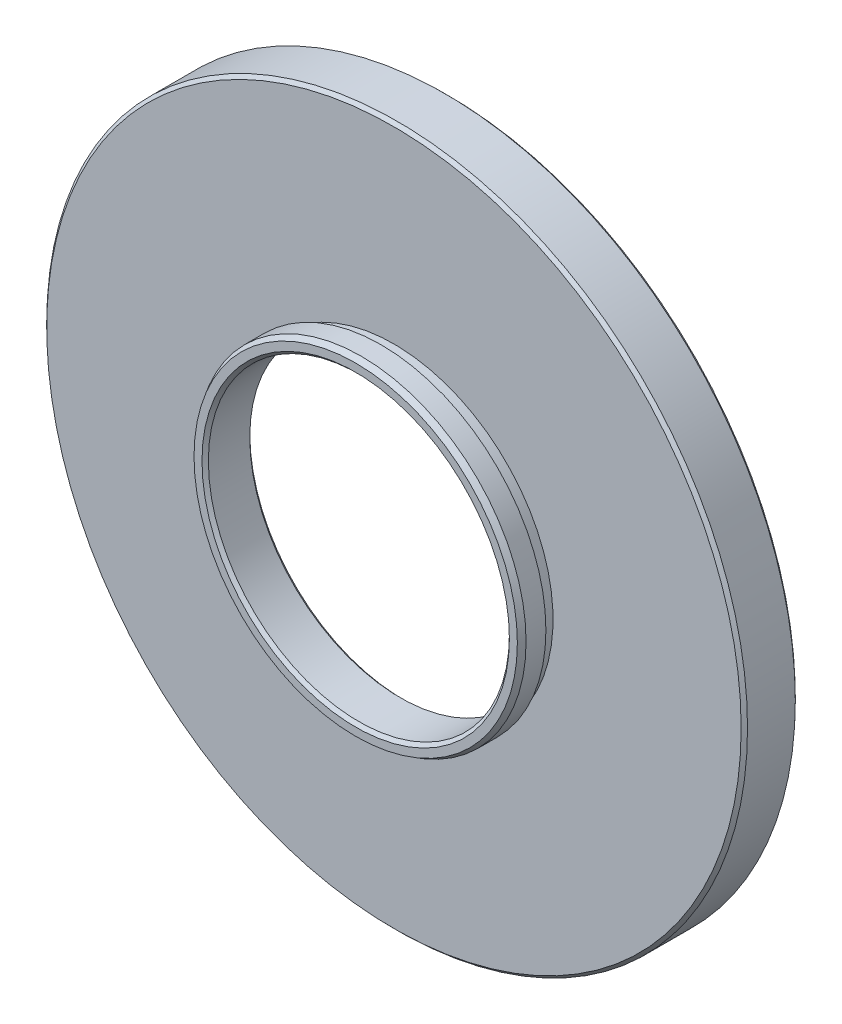
ISO-10303-21;
HEADER;
FILE_DESCRIPTION(('STEP AP214'),'2;1');
FILE_NAME('part.step','',(''),(''),'','','');
FILE_SCHEMA(('AUTOMOTIVE_DESIGN { 1 0 10303 214 1 1 1 1 }'));
ENDSEC;
DATA;
#1=APPLICATION_CONTEXT('core data for automotive mechanical design processes');
#2=APPLICATION_PROTOCOL_DEFINITION('international standard','automotive_design',2000,#1);
#3=PRODUCT_CONTEXT('',#1,'mechanical');
#4=PRODUCT('Part','Part','',(#3));
#5=PRODUCT_RELATED_PRODUCT_CATEGORY('part','',(#4));
#6=PRODUCT_DEFINITION_FORMATION('','',#4);
#7=PRODUCT_DEFINITION_CONTEXT('part definition',#1,'design');
#8=PRODUCT_DEFINITION('design','',#6,#7);
#9=PRODUCT_DEFINITION_SHAPE('','',#8);
#10=(LENGTH_UNIT() NAMED_UNIT(*) SI_UNIT(.MILLI.,.METRE.));
#11=(NAMED_UNIT(*) PLANE_ANGLE_UNIT() SI_UNIT($,.RADIAN.));
#12=(NAMED_UNIT(*) SI_UNIT($,.STERADIAN.) SOLID_ANGLE_UNIT());
#13=UNCERTAINTY_MEASURE_WITH_UNIT(LENGTH_MEASURE(1.E-05),#10,'distance_accuracy_value','');
#14=(GEOMETRIC_REPRESENTATION_CONTEXT(3) GLOBAL_UNCERTAINTY_ASSIGNED_CONTEXT((#13)) GLOBAL_UNIT_ASSIGNED_CONTEXT((#10,
#11,#12)) REPRESENTATION_CONTEXT('',''));
#15=CARTESIAN_POINT('',(0.,0.,0.));
#16=DIRECTION('',(0.,0.,1.));
#17=DIRECTION('',(1.,0.,0.));
#18=AXIS2_PLACEMENT_3D('',#15,#16,#17);
#19=CARTESIAN_POINT('',(0.,27.94,-4.318));
#20=DIRECTION('',(0.,0.,-1.));
#21=DIRECTION('',(-1.,0.,0.));
#22=AXIS2_PLACEMENT_3D('',#19,#20,#21);
#23=PLANE('',#22);
#24=CARTESIAN_POINT('',(0.,0.,-4.318));
#25=DIRECTION('',(0.,0.,-1.));
#26=DIRECTION('',(-1.,0.,0.));
#27=AXIS2_PLACEMENT_3D('',#24,#25,#26);
#28=CIRCLE('',#27,27.686);
#29=CARTESIAN_POINT('',(-27.686,0.,-4.318));
#30=VERTEX_POINT('',#29);
#31=EDGE_CURVE('E39',#30,#30,#28,.T.);
#32=ORIENTED_EDGE('',*,*,#31,.T.);
#33=EDGE_LOOP('',(#32));
#34=FACE_BOUND('',#33,.T.);
#35=CARTESIAN_POINT('',(0.,0.,-4.318));
#36=DIRECTION('',(0.,0.,-1.));
#37=DIRECTION('',(-1.,0.,0.));
#38=AXIS2_PLACEMENT_3D('',#35,#36,#37);
#39=CIRCLE('',#38,26.0985);
#40=CARTESIAN_POINT('',(-26.0985,0.,-4.318));
#41=VERTEX_POINT('',#40);
#42=EDGE_CURVE('E54',#41,#41,#39,.F.);
#43=ORIENTED_EDGE('',*,*,#42,.T.);
#44=EDGE_LOOP('',(#43));
#45=FACE_BOUND('',#44,.T.);
#46=ADVANCED_FACE('F14',(#34,#45),#23,.T.);
#47=CARTESIAN_POINT('',(0.,0.,-4.318));
#48=DIRECTION('',(0.,0.,-1.));
#49=DIRECTION('',(-1.,0.,0.));
#50=AXIS2_PLACEMENT_3D('',#47,#48,#49);
#51=CYLINDRICAL_SURFACE('',#50,27.94);
#52=CARTESIAN_POINT('',(0.,0.,-4.06400000000001));
#53=DIRECTION('',(0.,0.,-1.));
#54=DIRECTION('',(-1.,0.,0.));
#55=AXIS2_PLACEMENT_3D('',#52,#53,#54);
#56=CIRCLE('',#55,27.94);
#57=CARTESIAN_POINT('',(-27.94,0.,-4.06400000000001));
#58=VERTEX_POINT('',#57);
#59=EDGE_CURVE('E26',#58,#58,#56,.F.);
#60=ORIENTED_EDGE('',*,*,#59,.T.);
#61=EDGE_LOOP('',(#60));
#62=FACE_BOUND('',#61,.T.);
#63=CARTESIAN_POINT('',(0.,0.,-0.25399999999999));
#64=DIRECTION('',(0.,0.,1.));
#65=DIRECTION('',(1.,0.,0.));
#66=AXIS2_PLACEMENT_3D('',#63,#64,#65);
#67=CIRCLE('',#66,27.94);
#68=CARTESIAN_POINT('',(27.94,0.,-0.25399999999999));
#69=VERTEX_POINT('',#68);
#70=EDGE_CURVE('E34',#69,#69,#67,.F.);
#71=ORIENTED_EDGE('',*,*,#70,.T.);
#72=EDGE_LOOP('',(#71));
#73=FACE_BOUND('',#72,.T.);
#74=ADVANCED_FACE('F113',(#62,#73),#51,.T.);
#75=CARTESIAN_POINT('',(0.,27.94,0.));
#76=DIRECTION('',(0.,0.,1.));
#77=DIRECTION('',(1.,0.,0.));
#78=AXIS2_PLACEMENT_3D('',#75,#76,#77);
#79=PLANE('',#78);
#80=CARTESIAN_POINT('',(0.,0.,0.));
#81=DIRECTION('',(0.,0.,1.));
#82=DIRECTION('',(1.,0.,0.));
#83=AXIS2_PLACEMENT_3D('',#80,#81,#82);
#84=CIRCLE('',#83,27.686);
#85=CARTESIAN_POINT('',(27.686,0.,0.));
#86=VERTEX_POINT('',#85);
#87=EDGE_CURVE('E21',#86,#86,#84,.T.);
#88=ORIENTED_EDGE('',*,*,#87,.T.);
#89=EDGE_LOOP('',(#88));
#90=FACE_BOUND('',#89,.T.);
#91=CARTESIAN_POINT('',(0.,0.,0.));
#92=DIRECTION('',(0.,0.,-1.));
#93=DIRECTION('',(-1.,0.,0.));
#94=AXIS2_PLACEMENT_3D('',#91,#92,#93);
#95=CIRCLE('',#94,12.6873);
#96=CARTESIAN_POINT('',(-12.6873,0.,0.));
#97=VERTEX_POINT('',#96);
#98=EDGE_CURVE('E70',#97,#97,#95,.T.);
#99=ORIENTED_EDGE('',*,*,#98,.T.);
#100=EDGE_LOOP('',(#99));
#101=FACE_BOUND('',#100,.T.);
#102=ADVANCED_FACE('F118',(#90,#101),#79,.T.);
#103=CARTESIAN_POINT('',(0.,0.,-4.318));
#104=DIRECTION('',(0.,0.,-1.));
#105=DIRECTION('',(-1.,0.,0.));
#106=AXIS2_PLACEMENT_3D('',#103,#104,#105);
#107=CYLINDRICAL_SURFACE('',#106,12.6873);
#108=CARTESIAN_POINT('',(0.,0.,0.761999999999999));
#109=DIRECTION('',(0.,0.,-1.));
#110=DIRECTION('',(-1.,0.,0.));
#111=AXIS2_PLACEMENT_3D('',#108,#109,#110);
#112=CIRCLE('',#111,12.6873);
#113=CARTESIAN_POINT('',(-12.6873,0.,0.761999999999999));
#114=VERTEX_POINT('',#113);
#115=EDGE_CURVE('E74',#114,#114,#112,.T.);
#116=ORIENTED_EDGE('',*,*,#115,.T.);
#117=EDGE_LOOP('',(#116));
#118=FACE_BOUND('',#117,.T.);
#119=ORIENTED_EDGE('',*,*,#98,.F.);
#120=EDGE_LOOP('',(#119));
#121=FACE_BOUND('',#120,.T.);
#122=ADVANCED_FACE('F172',(#118,#121),#107,.T.);
#123=CARTESIAN_POINT('',(0.,0.,0.761999999999999));
#124=DIRECTION('',(0.,0.,1.));
#125=DIRECTION('',(1.,0.,0.));
#126=AXIS2_PLACEMENT_3D('',#123,#124,#125);
#127=CONICAL_SURFACE('',#126,12.6873,1.0471975511966);
#128=CARTESIAN_POINT('',(0.,0.,1.02596454307349));
#129=DIRECTION('',(0.,0.,-1.));
#130=DIRECTION('',(-1.,0.,0.));
#131=AXIS2_PLACEMENT_3D('',#128,#129,#130);
#132=CIRCLE('',#131,13.1445);
#133=CARTESIAN_POINT('',(-13.1445,0.,1.02596454307349));
#134=VERTEX_POINT('',#133);
#135=EDGE_CURVE('E78',#134,#134,#132,.T.);
#136=ORIENTED_EDGE('',*,*,#135,.T.);
#137=EDGE_LOOP('',(#136));
#138=FACE_BOUND('',#137,.T.);
#139=ORIENTED_EDGE('',*,*,#115,.F.);
#140=EDGE_LOOP('',(#139));
#141=FACE_BOUND('',#140,.T.);
#142=ADVANCED_FACE('F168',(#138,#141),#127,.T.);
#143=CARTESIAN_POINT('',(0.,0.,-4.318));
#144=DIRECTION('',(0.,0.,-1.));
#145=DIRECTION('',(-1.,0.,0.));
#146=AXIS2_PLACEMENT_3D('',#143,#144,#145);
#147=CYLINDRICAL_SURFACE('',#146,13.1445);
#148=CARTESIAN_POINT('',(0.,0.,2.60805909487752));
#149=DIRECTION('',(0.,0.,1.));
#150=DIRECTION('',(1.,0.,0.));
#151=AXIS2_PLACEMENT_3D('',#148,#149,#150);
#152=CIRCLE('',#151,13.1445);
#153=CARTESIAN_POINT('',(-13.1445,0.,2.60805909487752));
#154=VERTEX_POINT('',#153);
#155=EDGE_CURVE('E66',#154,#154,#152,.F.);
#156=ORIENTED_EDGE('',*,*,#155,.T.);
#157=EDGE_LOOP('',(#156));
#158=FACE_BOUND('',#157,.T.);
#159=ORIENTED_EDGE('',*,*,#135,.F.);
#160=EDGE_LOOP('',(#159));
#161=FACE_BOUND('',#160,.T.);
#162=ADVANCED_FACE('F162',(#158,#161),#147,.T.);
#163=CARTESIAN_POINT('',(0.,13.1445,3.048));
#164=DIRECTION('',(0.,0.,1.));
#165=DIRECTION('',(1.,0.,0.));
#166=AXIS2_PLACEMENT_3D('',#163,#164,#165);
#167=PLANE('',#166);
#168=CARTESIAN_POINT('',(0.,0.,3.048));
#169=DIRECTION('',(0.,0.,1.));
#170=DIRECTION('',(1.,0.,0.));
#171=AXIS2_PLACEMENT_3D('',#168,#169,#170);
#172=CIRCLE('',#171,12.2555);
#173=CARTESIAN_POINT('',(12.2555,0.,3.048));
#174=VERTEX_POINT('',#173);
#175=EDGE_CURVE('E10',#174,#174,#172,.F.);
#176=ORIENTED_EDGE('',*,*,#175,.T.);
#177=EDGE_LOOP('',(#176));
#178=FACE_BOUND('',#177,.T.);
#179=CARTESIAN_POINT('',(0.,0.,3.048));
#180=DIRECTION('',(0.,0.,1.));
#181=DIRECTION('',(1.,0.,0.));
#182=AXIS2_PLACEMENT_3D('',#179,#180,#181);
#183=CIRCLE('',#182,12.8905);
#184=CARTESIAN_POINT('',(-12.8905,0.,3.048));
#185=VERTEX_POINT('',#184);
#186=EDGE_CURVE('E62',#185,#185,#183,.T.);
#187=ORIENTED_EDGE('',*,*,#186,.T.);
#188=EDGE_LOOP('',(#187));
#189=FACE_BOUND('',#188,.T.);
#190=ADVANCED_FACE('F152',(#178,#189),#167,.T.);
#191=CARTESIAN_POINT('',(0.,0.,-4.318));
#192=DIRECTION('',(0.,0.,-1.));
#193=DIRECTION('',(-1.,0.,0.));
#194=AXIS2_PLACEMENT_3D('',#191,#192,#193);
#195=CYLINDRICAL_SURFACE('',#194,12.0015);
#196=CARTESIAN_POINT('',(0.,0.,-0.508000000000021));
#197=DIRECTION('',(0.,0.,-1.));
#198=DIRECTION('',(-1.,0.,0.));
#199=AXIS2_PLACEMENT_3D('',#196,#197,#198);
#200=CIRCLE('',#199,12.0015);
#201=CARTESIAN_POINT('',(-12.0015,0.,-0.508000000000021));
#202=VERTEX_POINT('',#201);
#203=EDGE_CURVE('E47',#202,#202,#200,.T.);
#204=ORIENTED_EDGE('',*,*,#203,.T.);
#205=EDGE_LOOP('',(#204));
#206=FACE_BOUND('',#205,.T.);
#207=CARTESIAN_POINT('',(0.,0.,2.79399999999999));
#208=DIRECTION('',(0.,0.,1.));
#209=DIRECTION('',(1.,0.,0.));
#210=AXIS2_PLACEMENT_3D('',#207,#208,#209);
#211=CIRCLE('',#210,12.0015);
#212=CARTESIAN_POINT('',(12.0015,0.,2.79399999999999));
#213=VERTEX_POINT('',#212);
#214=EDGE_CURVE('E51',#213,#213,#211,.T.);
#215=ORIENTED_EDGE('',*,*,#214,.T.);
#216=EDGE_LOOP('',(#215));
#217=FACE_BOUND('',#216,.T.);
#218=ADVANCED_FACE('F149',(#206,#217),#195,.F.);
#219=CARTESIAN_POINT('',(0.,12.0015,-0.762000000000003));
#220=DIRECTION('',(0.,0.,-1.));
#221=DIRECTION('',(-1.,0.,0.));
#222=AXIS2_PLACEMENT_3D('',#219,#220,#221);
#223=PLANE('',#222);
#224=CARTESIAN_POINT('',(0.,0.,-0.762000000000003));
#225=DIRECTION('',(0.,0.,-1.));
#226=DIRECTION('',(-1.,0.,0.));
#227=AXIS2_PLACEMENT_3D('',#224,#225,#226);
#228=CIRCLE('',#227,12.2555);
#229=CARTESIAN_POINT('',(-12.2555,0.,-0.762000000000003));
#230=VERTEX_POINT('',#229);
#231=EDGE_CURVE('E43',#230,#230,#228,.F.);
#232=ORIENTED_EDGE('',*,*,#231,.T.);
#233=EDGE_LOOP('',(#232));
#234=FACE_BOUND('',#233,.T.);
#235=CARTESIAN_POINT('',(0.,0.,-0.762000000000003));
#236=DIRECTION('',(0.,0.,-1.));
#237=DIRECTION('',(-1.,0.,0.));
#238=AXIS2_PLACEMENT_3D('',#235,#236,#237);
#239=CIRCLE('',#238,26.3525);
#240=CARTESIAN_POINT('',(-26.3525,0.,-0.762000000000003));
#241=VERTEX_POINT('',#240);
#242=EDGE_CURVE('E82',#241,#241,#239,.T.);
#243=ORIENTED_EDGE('',*,*,#242,.T.);
#244=EDGE_LOOP('',(#243));
#245=FACE_BOUND('',#244,.T.);
#246=ADVANCED_FACE('F151',(#234,#245),#223,.T.);
#247=CARTESIAN_POINT('',(0.,0.,-4.318));
#248=DIRECTION('',(0.,0.,-1.));
#249=DIRECTION('',(-1.,0.,0.));
#250=AXIS2_PLACEMENT_3D('',#247,#248,#249);
#251=CYLINDRICAL_SURFACE('',#250,26.3525);
#252=CARTESIAN_POINT('',(0.,0.,-1.524));
#253=DIRECTION('',(0.,0.,-1.));
#254=DIRECTION('',(-1.,0.,0.));
#255=AXIS2_PLACEMENT_3D('',#252,#253,#254);
#256=CIRCLE('',#255,26.3525);
#257=CARTESIAN_POINT('',(-26.3525,0.,-1.524));
#258=VERTEX_POINT('',#257);
#259=EDGE_CURVE('E85',#258,#258,#256,.T.);
#260=ORIENTED_EDGE('',*,*,#259,.T.);
#261=EDGE_LOOP('',(#260));
#262=FACE_BOUND('',#261,.T.);
#263=ORIENTED_EDGE('',*,*,#242,.F.);
#264=EDGE_LOOP('',(#263));
#265=FACE_BOUND('',#264,.T.);
#266=ADVANCED_FACE('F111',(#262,#265),#251,.F.);
#267=CARTESIAN_POINT('',(0.,26.3525,-1.524));
#268=DIRECTION('',(0.,0.,1.));
#269=DIRECTION('',(1.,0.,0.));
#270=AXIS2_PLACEMENT_3D('',#267,#268,#269);
#271=PLANE('',#270);
#272=CARTESIAN_POINT('',(0.,0.,-1.524));
#273=DIRECTION('',(0.,0.,-1.));
#274=DIRECTION('',(-1.,0.,0.));
#275=AXIS2_PLACEMENT_3D('',#272,#273,#274);
#276=CIRCLE('',#275,25.8445);
#277=CARTESIAN_POINT('',(-25.8445,0.,-1.524));
#278=VERTEX_POINT('',#277);
#279=EDGE_CURVE('E89',#278,#278,#276,.T.);
#280=ORIENTED_EDGE('',*,*,#279,.T.);
#281=EDGE_LOOP('',(#280));
#282=FACE_BOUND('',#281,.T.);
#283=ORIENTED_EDGE('',*,*,#259,.F.);
#284=EDGE_LOOP('',(#283));
#285=FACE_BOUND('',#284,.T.);
#286=ADVANCED_FACE('F94',(#282,#285),#271,.T.);
#287=CARTESIAN_POINT('',(0.,0.,-4.318));
#288=DIRECTION('',(0.,0.,-1.));
#289=DIRECTION('',(-1.,0.,0.));
#290=AXIS2_PLACEMENT_3D('',#287,#288,#289);
#291=CYLINDRICAL_SURFACE('',#290,25.8445);
#292=CARTESIAN_POINT('',(0.,0.,-3.87805909487755));
#293=DIRECTION('',(0.,0.,-1.));
#294=DIRECTION('',(-1.,0.,0.));
#295=AXIS2_PLACEMENT_3D('',#292,#293,#294);
#296=CIRCLE('',#295,25.8445);
#297=CARTESIAN_POINT('',(-25.8445,0.,-3.87805909487755));
#298=VERTEX_POINT('',#297);
#299=EDGE_CURVE('E58',#298,#298,#296,.T.);
#300=ORIENTED_EDGE('',*,*,#299,.T.);
#301=EDGE_LOOP('',(#300));
#302=FACE_BOUND('',#301,.T.);
#303=ORIENTED_EDGE('',*,*,#279,.F.);
#304=EDGE_LOOP('',(#303));
#305=FACE_BOUND('',#304,.T.);
#306=ADVANCED_FACE('F97',(#302,#305),#291,.F.);
#307=CARTESIAN_POINT('',(0.,0.,2.60805909487752));
#308=DIRECTION('',(0.,0.,-1.));
#309=DIRECTION('',(-1.,0.,0.));
#310=AXIS2_PLACEMENT_3D('',#307,#308,#309);
#311=CONICAL_SURFACE('',#310,13.1445,0.523598775598309);
#312=CARTESIAN_POINT('',(-12.8905,0.,3.048));
#313=CARTESIAN_POINT('',(-12.8931458333333,0.,3.04341728223831));
#314=CARTESIAN_POINT('',(-12.8957916666667,0.,3.03883456447661));
#315=CARTESIAN_POINT('',(-12.9010833333333,0.,3.02966912895323));
#316=CARTESIAN_POINT('',(-12.9037291666667,0.,3.02508641119154));
#317=CARTESIAN_POINT('',(-12.9090208333333,0.,3.01592097566815));
#318=CARTESIAN_POINT('',(-12.9116666666667,0.,3.01133825790646));
#319=CARTESIAN_POINT('',(-12.9169583333333,0.,3.00217282238307));
#320=CARTESIAN_POINT('',(-12.9196041666667,0.,2.99759010462138));
#321=CARTESIAN_POINT('',(-12.9248958333333,0.,2.988424669098));
#322=CARTESIAN_POINT('',(-12.9275416666667,0.,2.9838419513363));
#323=CARTESIAN_POINT('',(-12.9328333333333,0.,2.97467651581292));
#324=CARTESIAN_POINT('',(-12.9354791666667,0.,2.97009379805123));
#325=CARTESIAN_POINT('',(-12.9407708333333,0.,2.96092836252784));
#326=CARTESIAN_POINT('',(-12.9434166666667,0.,2.95634564476615));
#327=CARTESIAN_POINT('',(-12.9487083333333,0.,2.94718020924276));
#328=CARTESIAN_POINT('',(-12.9513541666667,0.,2.94259749148107));
#329=CARTESIAN_POINT('',(-12.9566458333333,0.,2.93343205595769));
#330=CARTESIAN_POINT('',(-12.9592916666667,0.,2.92884933819599));
#331=CARTESIAN_POINT('',(-12.9645833333333,0.,2.91968390267261));
#332=CARTESIAN_POINT('',(-12.9672291666667,0.,2.91510118491092));
#333=CARTESIAN_POINT('',(-12.9725208333333,0.,2.90593574938753));
#334=CARTESIAN_POINT('',(-12.9751666666667,0.,2.90135303162584));
#335=CARTESIAN_POINT('',(-12.9804583333333,0.,2.89218759610245));
#336=CARTESIAN_POINT('',(-12.9831041666667,0.,2.88760487834076));
#337=CARTESIAN_POINT('',(-12.9883958333333,0.,2.87843944281738));
#338=CARTESIAN_POINT('',(-12.9910416666667,0.,2.87385672505568));
#339=CARTESIAN_POINT('',(-12.9963333333333,0.,2.8646912895323));
#340=CARTESIAN_POINT('',(-12.9989791666667,0.,2.86010857177061));
#341=CARTESIAN_POINT('',(-13.0042708333333,0.,2.85094313624722));
#342=CARTESIAN_POINT('',(-13.0069166666667,0.,2.84636041848553));
#343=CARTESIAN_POINT('',(-13.0122083333333,0.,2.83719498296214));
#344=CARTESIAN_POINT('',(-13.0148541666667,0.,2.83261226520045));
#345=CARTESIAN_POINT('',(-13.0201458333333,0.,2.82344682967707));
#346=CARTESIAN_POINT('',(-13.0227916666667,0.,2.81886411191537));
#347=CARTESIAN_POINT('',(-13.0280833333333,0.,2.80969867639199));
#348=CARTESIAN_POINT('',(-13.0307291666667,0.,2.8051159586303));
#349=CARTESIAN_POINT('',(-13.0360208333333,0.,2.79595052310691));
#350=CARTESIAN_POINT('',(-13.0386666666667,0.,2.79136780534522));
#351=CARTESIAN_POINT('',(-13.0439583333333,0.,2.78220236982183));
#352=CARTESIAN_POINT('',(-13.0466041666667,0.,2.77761965206014));
#353=CARTESIAN_POINT('',(-13.0518958333333,0.,2.76845421653676));
#354=CARTESIAN_POINT('',(-13.0545416666667,0.,2.76387149877506));
#355=CARTESIAN_POINT('',(-13.0598333333333,0.,2.75470606325168));
#356=CARTESIAN_POINT('',(-13.0624791666667,0.,2.75012334548999));
#357=CARTESIAN_POINT('',(-13.0677708333333,0.,2.7409579099666));
#358=CARTESIAN_POINT('',(-13.0704166666667,0.,2.73637519220491));
#359=CARTESIAN_POINT('',(-13.0757083333333,0.,2.72720975668152));
#360=CARTESIAN_POINT('',(-13.0783541666667,0.,2.72262703891983));
#361=CARTESIAN_POINT('',(-13.0836458333333,0.,2.71346160339645));
#362=CARTESIAN_POINT('',(-13.0862916666667,0.,2.70887888563475));
#363=CARTESIAN_POINT('',(-13.0915833333333,0.,2.69971345011137));
#364=CARTESIAN_POINT('',(-13.0942291666667,0.,2.69513073234968));
#365=CARTESIAN_POINT('',(-13.0995208333333,0.,2.68596529682629));
#366=CARTESIAN_POINT('',(-13.1021666666667,0.,2.6813825790646));
#367=CARTESIAN_POINT('',(-13.1074583333333,0.,2.67221714354121));
#368=CARTESIAN_POINT('',(-13.1101041666667,0.,2.66763442577952));
#369=CARTESIAN_POINT('',(-13.1153958333333,0.,2.65846899025614));
#370=CARTESIAN_POINT('',(-13.1180416666667,0.,2.65388627249444));
#371=CARTESIAN_POINT('',(-13.1233333333333,0.,2.64472083697106));
#372=CARTESIAN_POINT('',(-13.1259791666667,0.,2.64013811920937));
#373=CARTESIAN_POINT('',(-13.1312708333333,0.,2.63097268368598));
#374=CARTESIAN_POINT('',(-13.1339166666667,0.,2.62638996592429));
#375=CARTESIAN_POINT('',(-13.1392083333333,0.,2.6172245304009));
#376=CARTESIAN_POINT('',(-13.1418541666667,0.,2.61264181263921));
#377=CARTESIAN_POINT('',(-13.1445,0.,2.60805909487752));
#378=B_SPLINE_CURVE_WITH_KNOTS('',3,(#312,#313,#314,#315,#316,#317,#318,#319,#320,#321,#322,
#323,#324,#325,#326,#327,#328,#329,#330,#331,#332,#333,#334,#335,#336,#337,#338,#339,#340,#341,
#342,#343,#344,#345,#346,#347,#348,#349,#350,#351,#352,#353,#354,#355,#356,#357,#358,#359,#360,
#361,#362,#363,#364,#365,#366,#367,#368,#369,#370,#371,#372,#373,#374,#375,#376,#377),
.UNSPECIFIED.,.F.,.F.,(4,2,2,2,2,2,2,2,2,2,2,2,2,2,2,2,2,2,2,2,2,2,2,2,2,2,2,2,2,2,2,2,4),(0.,
0.0158749999999991,0.0317499999999992,0.0476249999999983,0.0634999999999987,0.0793749999999978,
0.095249999999997,0.111124999999997,0.126999999999996,0.142874999999996,0.158749999999996,
0.174624999999995,0.190499999999995,0.206374999999994,0.222249999999994,0.238124999999994,
0.253999999999993,0.269874999999992,0.285749999999992,0.301624999999991,0.317499999999992,
0.333374999999991,0.34924999999999,0.36512499999999,0.380999999999989,0.396874999999989,
0.412749999999989,0.428624999999988,0.444499999999988,0.460374999999987,0.476249999999986,
0.492124999999986,0.507999999999985),.UNSPECIFIED.);
#379=EDGE_CURVE('BSEAM99',#185,#154,#378,.T.);
#380=ORIENTED_EDGE('',*,*,#186,.F.);
#381=ORIENTED_EDGE('',*,*,#155,.F.);
#382=ORIENTED_EDGE('',*,*,#379,.T.);
#383=ORIENTED_EDGE('',*,*,#379,.F.);
#384=EDGE_LOOP('',(#380,#382,#381,#383));
#385=FACE_BOUND('',#384,.T.);
#386=ADVANCED_FACE('F99',(#385),#311,.T.);
#387=CARTESIAN_POINT('',(0.,0.,-3.87805909487755));
#388=DIRECTION('',(0.,0.,-1.));
#389=DIRECTION('',(-1.,0.,0.));
#390=AXIS2_PLACEMENT_3D('',#387,#388,#389);
#391=CONICAL_SURFACE('',#390,25.8445,0.523598775598297);
#392=CARTESIAN_POINT('',(-26.0985,0.,-4.318));
#393=CARTESIAN_POINT('',(-26.0958541666666,0.,-4.31341728223831));
#394=CARTESIAN_POINT('',(-26.0932083333333,0.,-4.30883456447662));
#395=CARTESIAN_POINT('',(-26.0879166666666,0.,-4.29966912895323));
#396=CARTESIAN_POINT('',(-26.0852708333333,0.,-4.29508641119154));
#397=CARTESIAN_POINT('',(-26.0799791666666,0.,-4.28592097566816));
#398=CARTESIAN_POINT('',(-26.0773333333333,0.,-4.28133825790646));
#399=CARTESIAN_POINT('',(-26.0720416666666,0.,-4.27217282238308));
#400=CARTESIAN_POINT('',(-26.0693958333333,0.,-4.26759010462139));
#401=CARTESIAN_POINT('',(-26.0641041666666,0.,-4.258424669098));
#402=CARTESIAN_POINT('',(-26.0614583333333,0.,-4.25384195133631));
#403=CARTESIAN_POINT('',(-26.0561666666666,0.,-4.24467651581293));
#404=CARTESIAN_POINT('',(-26.0535208333333,0.,-4.24009379805123));
#405=CARTESIAN_POINT('',(-26.0482291666666,0.,-4.23092836252785));
#406=CARTESIAN_POINT('',(-26.0455833333333,0.,-4.22634564476616));
#407=CARTESIAN_POINT('',(-26.0402916666667,0.,-4.21718020924277));
#408=CARTESIAN_POINT('',(-26.0376458333333,0.,-4.21259749148108));
#409=CARTESIAN_POINT('',(-26.0323541666667,0.,-4.2034320559577));
#410=CARTESIAN_POINT('',(-26.0297083333333,0.,-4.198849338196));
#411=CARTESIAN_POINT('',(-26.0244166666666,0.,-4.18968390267262));
#412=CARTESIAN_POINT('',(-26.0217708333333,0.,-4.18510118491093));
#413=CARTESIAN_POINT('',(-26.0164791666667,0.,-4.17593574938754));
#414=CARTESIAN_POINT('',(-26.0138333333333,0.,-4.17135303162585));
#415=CARTESIAN_POINT('',(-26.0085416666667,0.,-4.16218759610247));
#416=CARTESIAN_POINT('',(-26.0058958333333,0.,-4.15760487834077));
#417=CARTESIAN_POINT('',(-26.0006041666667,0.,-4.14843944281739));
#418=CARTESIAN_POINT('',(-25.9979583333333,0.,-4.1438567250557));
#419=CARTESIAN_POINT('',(-25.9926666666667,0.,-4.13469128953231));
#420=CARTESIAN_POINT('',(-25.9900208333333,0.,-4.13010857177062));
#421=CARTESIAN_POINT('',(-25.9847291666667,0.,-4.12094313624724));
#422=CARTESIAN_POINT('',(-25.9820833333333,0.,-4.11636041848554));
#423=CARTESIAN_POINT('',(-25.9767916666667,0.,-4.10719498296216));
#424=CARTESIAN_POINT('',(-25.9741458333333,0.,-4.10261226520047));
#425=CARTESIAN_POINT('',(-25.9688541666667,0.,-4.09344682967708));
#426=CARTESIAN_POINT('',(-25.9662083333333,0.,-4.08886411191539));
#427=CARTESIAN_POINT('',(-25.9609166666667,0.,-4.07969867639201));
#428=CARTESIAN_POINT('',(-25.9582708333333,0.,-4.07511595863031));
#429=CARTESIAN_POINT('',(-25.9529791666667,0.,-4.06595052310693));
#430=CARTESIAN_POINT('',(-25.9503333333333,0.,-4.06136780534524));
#431=CARTESIAN_POINT('',(-25.9450416666667,0.,-4.05220236982185));
#432=CARTESIAN_POINT('',(-25.9423958333333,0.,-4.04761965206016));
#433=CARTESIAN_POINT('',(-25.9371041666667,0.,-4.03845421653677));
#434=CARTESIAN_POINT('',(-25.9344583333333,0.,-4.03387149877508));
#435=CARTESIAN_POINT('',(-25.9291666666667,0.,-4.0247060632517));
#436=CARTESIAN_POINT('',(-25.9265208333333,0.,-4.02012334549001));
#437=CARTESIAN_POINT('',(-25.9212291666667,0.,-4.01095790996662));
#438=CARTESIAN_POINT('',(-25.9185833333333,0.,-4.00637519220493));
#439=CARTESIAN_POINT('',(-25.9132916666667,0.,-3.99720975668155));
#440=CARTESIAN_POINT('',(-25.9106458333333,0.,-3.99262703891985));
#441=CARTESIAN_POINT('',(-25.9053541666667,0.,-3.98346160339647));
#442=CARTESIAN_POINT('',(-25.9027083333333,0.,-3.97887888563478));
#443=CARTESIAN_POINT('',(-25.8974166666667,0.,-3.96971345011139));
#444=CARTESIAN_POINT('',(-25.8947708333333,0.,-3.9651307323497));
#445=CARTESIAN_POINT('',(-25.8894791666667,0.,-3.95596529682632));
#446=CARTESIAN_POINT('',(-25.8868333333333,0.,-3.95138257906462));
#447=CARTESIAN_POINT('',(-25.8815416666667,0.,-3.94221714354124));
#448=CARTESIAN_POINT('',(-25.8788958333333,0.,-3.93763442577955));
#449=CARTESIAN_POINT('',(-25.8736041666667,0.,-3.92846899025616));
#450=CARTESIAN_POINT('',(-25.8709583333333,0.,-3.92388627249447));
#451=CARTESIAN_POINT('',(-25.8656666666667,0.,-3.91472083697108));
#452=CARTESIAN_POINT('',(-25.8630208333333,0.,-3.91013811920939));
#453=CARTESIAN_POINT('',(-25.8577291666667,0.,-3.90097268368601));
#454=CARTESIAN_POINT('',(-25.8550833333333,0.,-3.89638996592432));
#455=CARTESIAN_POINT('',(-25.8497916666667,0.,-3.88722453040093));
#456=CARTESIAN_POINT('',(-25.8471458333333,0.,-3.88264181263924));
#457=CARTESIAN_POINT('',(-25.8445,0.,-3.87805909487755));
#458=B_SPLINE_CURVE_WITH_KNOTS('',3,(#392,#393,#394,#395,#396,#397,#398,#399,#400,#401,#402,
#403,#404,#405,#406,#407,#408,#409,#410,#411,#412,#413,#414,#415,#416,#417,#418,#419,#420,#421,
#422,#423,#424,#425,#426,#427,#428,#429,#430,#431,#432,#433,#434,#435,#436,#437,#438,#439,#440,
#441,#442,#443,#444,#445,#446,#447,#448,#449,#450,#451,#452,#453,#454,#455,#456,#457),
.UNSPECIFIED.,.F.,.F.,(4,2,2,2,2,2,2,2,2,2,2,2,2,2,2,2,2,2,2,2,2,2,2,2,2,2,2,2,2,2,2,2,4),(0.,
0.0158749999999991,0.0317499999999975,0.0476249999999959,0.0634999999999943,0.0793749999999935,
0.0952499999999919,0.11112499999999,0.126999999999989,0.142874999999988,0.158749999999986,
0.174624999999985,0.190499999999984,0.206374999999982,0.222249999999981,0.238124999999979,
0.253999999999978,0.269874999999976,0.285749999999975,0.301624999999973,0.317499999999972,
0.333374999999971,0.349249999999969,0.365124999999968,0.380999999999967,0.396874999999965,
0.412749999999963,0.428624999999962,0.444499999999961,0.460374999999959,0.476249999999958,
0.492124999999957,0.507999999999955),.UNSPECIFIED.);
#459=EDGE_CURVE('BSEAM107',#41,#298,#458,.T.);
#460=ORIENTED_EDGE('',*,*,#42,.F.);
#461=ORIENTED_EDGE('',*,*,#299,.F.);
#462=ORIENTED_EDGE('',*,*,#459,.T.);
#463=ORIENTED_EDGE('',*,*,#459,.F.);
#464=EDGE_LOOP('',(#460,#462,#461,#463));
#465=FACE_BOUND('',#464,.T.);
#466=ADVANCED_FACE('F107',(#465),#391,.F.);
#467=CARTESIAN_POINT('',(0.,0.,-0.508000000000021));
#468=DIRECTION('',(0.,0.,-1.));
#469=DIRECTION('',(-1.,0.,0.));
#470=AXIS2_PLACEMENT_3D('',#467,#468,#469);
#471=CONICAL_SURFACE('',#470,12.0015,0.785398163397452);
#472=ORIENTED_EDGE('',*,*,#231,.F.);
#473=EDGE_LOOP('',(#472));
#474=FACE_BOUND('',#473,.T.);
#475=ORIENTED_EDGE('',*,*,#203,.F.);
#476=EDGE_LOOP('',(#475));
#477=FACE_BOUND('',#476,.T.);
#478=ADVANCED_FACE('F125',(#474,#477),#471,.F.);
#479=CARTESIAN_POINT('',(0.,0.,-4.318));
#480=DIRECTION('',(0.,0.,1.));
#481=DIRECTION('',(1.,0.,0.));
#482=AXIS2_PLACEMENT_3D('',#479,#480,#481);
#483=CONICAL_SURFACE('',#482,27.686,0.785398163397442);
#484=ORIENTED_EDGE('',*,*,#59,.F.);
#485=EDGE_LOOP('',(#484));
#486=FACE_BOUND('',#485,.T.);
#487=ORIENTED_EDGE('',*,*,#31,.F.);
#488=EDGE_LOOP('',(#487));
#489=FACE_BOUND('',#488,.T.);
#490=ADVANCED_FACE('F129',(#486,#489),#483,.T.);
#491=CARTESIAN_POINT('',(0.,0.,-0.25399999999999));
#492=DIRECTION('',(0.,0.,-1.));
#493=DIRECTION('',(-1.,0.,0.));
#494=AXIS2_PLACEMENT_3D('',#491,#492,#493);
#495=CONICAL_SURFACE('',#494,27.94,0.785398163397469);
#496=ORIENTED_EDGE('',*,*,#87,.F.);
#497=EDGE_LOOP('',(#496));
#498=FACE_BOUND('',#497,.T.);
#499=ORIENTED_EDGE('',*,*,#70,.F.);
#500=EDGE_LOOP('',(#499));
#501=FACE_BOUND('',#500,.T.);
#502=ADVANCED_FACE('F132',(#498,#501),#495,.T.);
#503=CARTESIAN_POINT('',(0.,0.,3.048));
#504=DIRECTION('',(0.,0.,1.));
#505=DIRECTION('',(1.,0.,0.));
#506=AXIS2_PLACEMENT_3D('',#503,#504,#505);
#507=CONICAL_SURFACE('',#506,12.2555,0.785398163397448);
#508=ORIENTED_EDGE('',*,*,#214,.F.);
#509=EDGE_LOOP('',(#508));
#510=FACE_BOUND('',#509,.T.);
#511=ORIENTED_EDGE('',*,*,#175,.F.);
#512=EDGE_LOOP('',(#511));
#513=FACE_BOUND('',#512,.T.);
#514=ADVANCED_FACE('F16',(#510,#513),#507,.F.);
#515=CLOSED_SHELL('',(#46,#74,#102,#122,#142,#162,#190,#218,#246,#266,#286,#306,#386,#466,#478,
#490,#502,#514));
#516=MANIFOLD_SOLID_BREP('B1',#515);
#517=ADVANCED_BREP_SHAPE_REPRESENTATION('',(#18,#516),#14);
#518=SHAPE_DEFINITION_REPRESENTATION(#9,#517);
ENDSEC;
END-ISO-10303-21;
